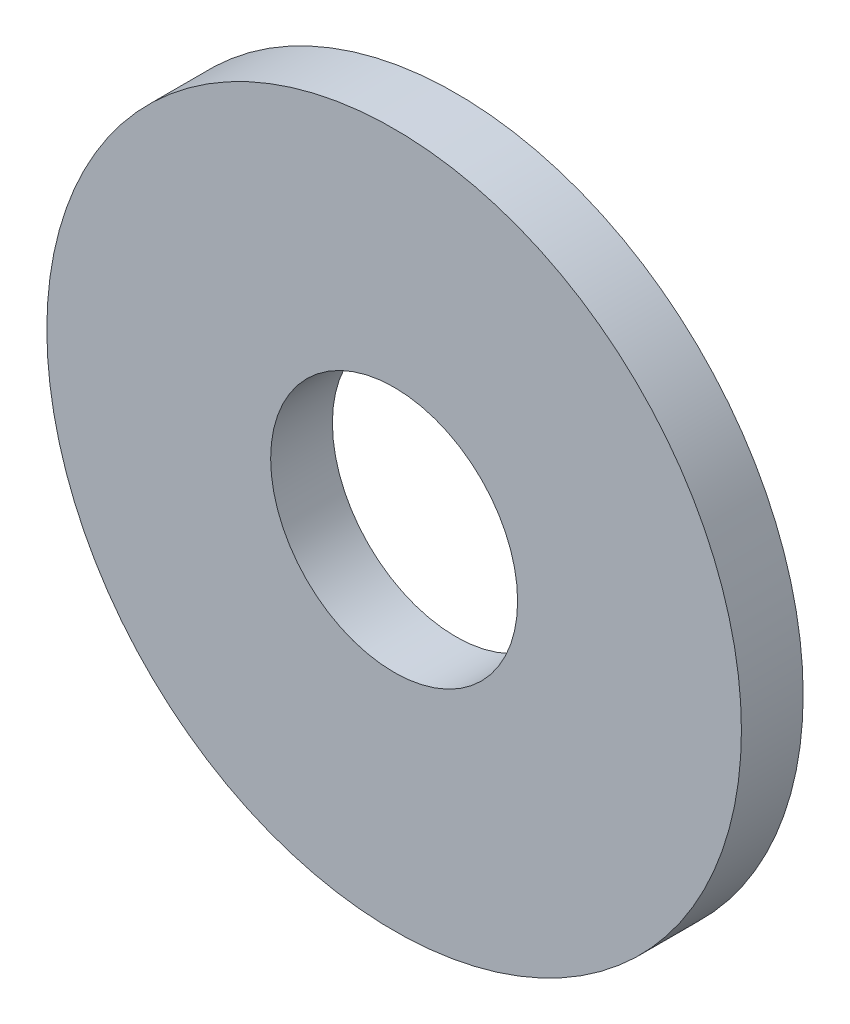
ISO-10303-21;
HEADER;
FILE_DESCRIPTION(('STEP AP214'),'2;1');
FILE_NAME('part.step','',(''),(''),'','','');
FILE_SCHEMA(('AUTOMOTIVE_DESIGN { 1 0 10303 214 1 1 1 1 }'));
ENDSEC;
DATA;
#1=APPLICATION_CONTEXT('core data for automotive mechanical design processes');
#2=APPLICATION_PROTOCOL_DEFINITION('international standard','automotive_design',2000,#1);
#3=PRODUCT_CONTEXT('',#1,'mechanical');
#4=PRODUCT('Part','Part','',(#3));
#5=PRODUCT_RELATED_PRODUCT_CATEGORY('part','',(#4));
#6=PRODUCT_DEFINITION_FORMATION('','',#4);
#7=PRODUCT_DEFINITION_CONTEXT('part definition',#1,'design');
#8=PRODUCT_DEFINITION('design','',#6,#7);
#9=PRODUCT_DEFINITION_SHAPE('','',#8);
#10=(LENGTH_UNIT() NAMED_UNIT(*) SI_UNIT(.MILLI.,.METRE.));
#11=(NAMED_UNIT(*) PLANE_ANGLE_UNIT() SI_UNIT($,.RADIAN.));
#12=(NAMED_UNIT(*) SI_UNIT($,.STERADIAN.) SOLID_ANGLE_UNIT());
#13=UNCERTAINTY_MEASURE_WITH_UNIT(LENGTH_MEASURE(1.E-05),#10,'distance_accuracy_value','');
#14=(GEOMETRIC_REPRESENTATION_CONTEXT(3) GLOBAL_UNCERTAINTY_ASSIGNED_CONTEXT((#13)) GLOBAL_UNIT_ASSIGNED_CONTEXT((#10,
#11,#12)) REPRESENTATION_CONTEXT('',''));
#15=CARTESIAN_POINT('',(0.,0.,0.));
#16=DIRECTION('',(0.,0.,1.));
#17=DIRECTION('',(1.,0.,0.));
#18=AXIS2_PLACEMENT_3D('',#15,#16,#17);
#19=CARTESIAN_POINT('',(0.,0.,1.6));
#20=DIRECTION('',(0.,0.,1.));
#21=DIRECTION('',(1.,0.,0.));
#22=AXIS2_PLACEMENT_3D('',#19,#20,#21);
#23=PLANE('',#22);
#24=CARTESIAN_POINT('',(0.,0.,1.6));
#25=DIRECTION('',(0.,0.,1.));
#26=DIRECTION('',(1.,0.,0.));
#27=AXIS2_PLACEMENT_3D('',#24,#25,#26);
#28=CIRCLE('',#27,9.);
#29=CARTESIAN_POINT('',(9.,0.,1.6));
#30=VERTEX_POINT('',#29);
#31=EDGE_CURVE('E10',#30,#30,#28,.T.);
#32=ORIENTED_EDGE('',*,*,#31,.T.);
#33=EDGE_LOOP('',(#32));
#34=FACE_BOUND('',#33,.T.);
#35=CARTESIAN_POINT('',(0.,0.,1.6));
#36=DIRECTION('',(0.,0.,1.));
#37=DIRECTION('',(1.,0.,0.));
#38=AXIS2_PLACEMENT_3D('',#35,#36,#37);
#39=CIRCLE('',#38,3.2);
#40=CARTESIAN_POINT('',(3.2,0.,1.6));
#41=VERTEX_POINT('',#40);
#42=EDGE_CURVE('E47',#41,#41,#39,.T.);
#43=ORIENTED_EDGE('',*,*,#42,.F.);
#44=EDGE_LOOP('',(#43));
#45=FACE_BOUND('',#44,.T.);
#46=ADVANCED_FACE('F36',(#34,#45),#23,.T.);
#47=CARTESIAN_POINT('',(0.,0.,0.));
#48=DIRECTION('',(0.,0.,1.));
#49=DIRECTION('',(1.,0.,0.));
#50=AXIS2_PLACEMENT_3D('',#47,#48,#49);
#51=PLANE('',#50);
#52=CARTESIAN_POINT('',(0.,0.,0.));
#53=DIRECTION('',(0.,0.,1.));
#54=DIRECTION('',(1.,0.,0.));
#55=AXIS2_PLACEMENT_3D('',#52,#53,#54);
#56=CIRCLE('',#55,9.);
#57=CARTESIAN_POINT('',(9.,0.,0.));
#58=VERTEX_POINT('',#57);
#59=EDGE_CURVE('E40',#58,#58,#56,.T.);
#60=ORIENTED_EDGE('',*,*,#59,.F.);
#61=EDGE_LOOP('',(#60));
#62=FACE_BOUND('',#61,.T.);
#63=CARTESIAN_POINT('',(0.,0.,0.));
#64=DIRECTION('',(0.,0.,1.));
#65=DIRECTION('',(1.,0.,0.));
#66=AXIS2_PLACEMENT_3D('',#63,#64,#65);
#67=CIRCLE('',#66,3.2);
#68=CARTESIAN_POINT('',(3.2,0.,0.));
#69=VERTEX_POINT('',#68);
#70=EDGE_CURVE('E49',#69,#69,#67,.T.);
#71=ORIENTED_EDGE('',*,*,#70,.T.);
#72=EDGE_LOOP('',(#71));
#73=FACE_BOUND('',#72,.T.);
#74=ADVANCED_FACE('F59',(#62,#73),#51,.F.);
#75=CARTESIAN_POINT('',(0.,0.,1.6));
#76=DIRECTION('',(0.,0.,-1.));
#77=DIRECTION('',(-1.,0.,0.));
#78=AXIS2_PLACEMENT_3D('',#75,#76,#77);
#79=CYLINDRICAL_SURFACE('',#78,9.);
#80=ORIENTED_EDGE('',*,*,#31,.F.);
#81=EDGE_LOOP('',(#80));
#82=FACE_BOUND('',#81,.T.);
#83=ORIENTED_EDGE('',*,*,#59,.T.);
#84=EDGE_LOOP('',(#83));
#85=FACE_BOUND('',#84,.T.);
#86=ADVANCED_FACE('F38',(#82,#85),#79,.T.);
#87=CARTESIAN_POINT('',(0.,0.,1.6));
#88=DIRECTION('',(0.,0.,-1.));
#89=DIRECTION('',(-1.,0.,0.));
#90=AXIS2_PLACEMENT_3D('',#87,#88,#89);
#91=CYLINDRICAL_SURFACE('',#90,3.2);
#92=ORIENTED_EDGE('',*,*,#42,.T.);
#93=EDGE_LOOP('',(#92));
#94=FACE_BOUND('',#93,.T.);
#95=ORIENTED_EDGE('',*,*,#70,.F.);
#96=EDGE_LOOP('',(#95));
#97=FACE_BOUND('',#96,.T.);
#98=ADVANCED_FACE('F55',(#94,#97),#91,.F.);
#99=CLOSED_SHELL('',(#46,#74,#86,#98));
#100=MANIFOLD_SOLID_BREP('B2',#99);
#101=ADVANCED_BREP_SHAPE_REPRESENTATION('',(#18,#100),#14);
#102=SHAPE_DEFINITION_REPRESENTATION(#9,#101);
ENDSEC;
END-ISO-10303-21;
